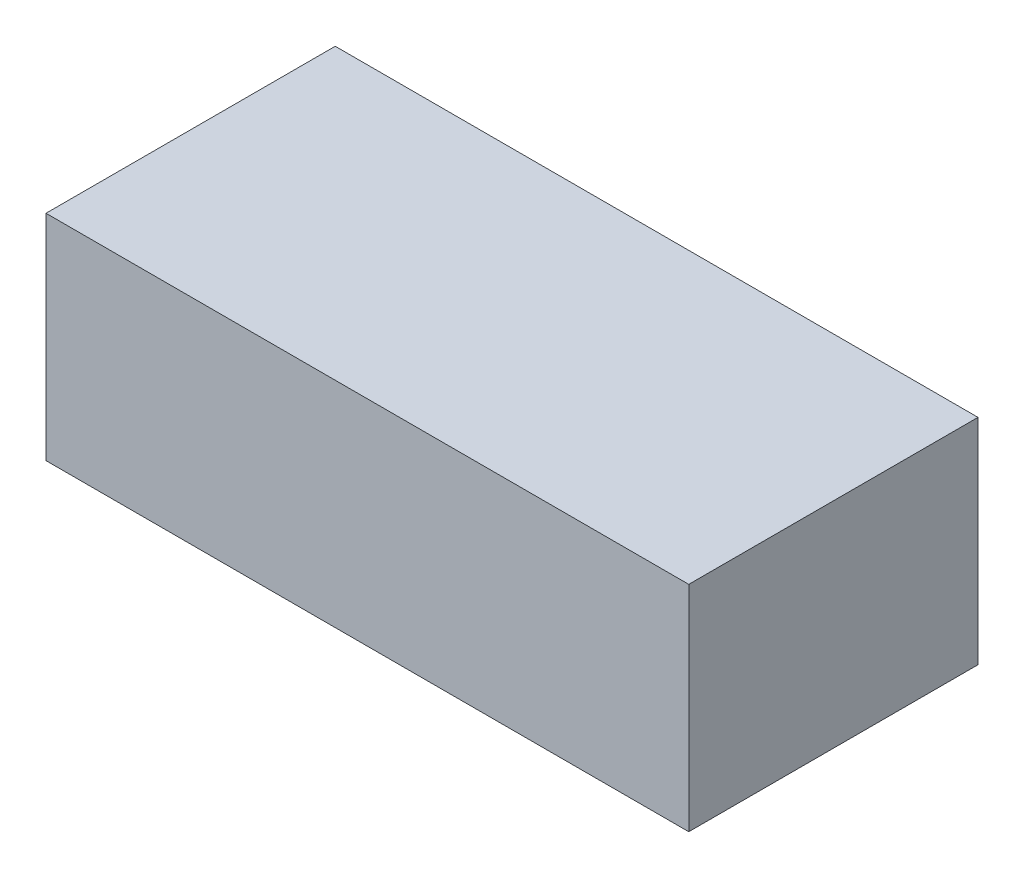
ISO-10303-21;
HEADER;
FILE_DESCRIPTION(('STEP AP214'),'2;1');
FILE_NAME('part.step','',(''),(''),'','','');
FILE_SCHEMA(('AUTOMOTIVE_DESIGN { 1 0 10303 214 1 1 1 1 }'));
ENDSEC;
DATA;
#1=APPLICATION_CONTEXT('core data for automotive mechanical design processes');
#2=APPLICATION_PROTOCOL_DEFINITION('international standard','automotive_design',2000,#1);
#3=PRODUCT_CONTEXT('',#1,'mechanical');
#4=PRODUCT('Part','Part','',(#3));
#5=PRODUCT_RELATED_PRODUCT_CATEGORY('part','',(#4));
#6=PRODUCT_DEFINITION_FORMATION('','',#4);
#7=PRODUCT_DEFINITION_CONTEXT('part definition',#1,'design');
#8=PRODUCT_DEFINITION('design','',#6,#7);
#9=PRODUCT_DEFINITION_SHAPE('','',#8);
#10=(LENGTH_UNIT() NAMED_UNIT(*) SI_UNIT(.MILLI.,.METRE.));
#11=(NAMED_UNIT(*) PLANE_ANGLE_UNIT() SI_UNIT($,.RADIAN.));
#12=(NAMED_UNIT(*) SI_UNIT($,.STERADIAN.) SOLID_ANGLE_UNIT());
#13=UNCERTAINTY_MEASURE_WITH_UNIT(LENGTH_MEASURE(1.E-05),#10,'distance_accuracy_value','');
#14=(GEOMETRIC_REPRESENTATION_CONTEXT(3) GLOBAL_UNCERTAINTY_ASSIGNED_CONTEXT((#13)) GLOBAL_UNIT_ASSIGNED_CONTEXT((#10,
#11,#12)) REPRESENTATION_CONTEXT('',''));
#15=CARTESIAN_POINT('',(0.,0.,0.));
#16=DIRECTION('',(0.,0.,1.));
#17=DIRECTION('',(1.,0.,0.));
#18=AXIS2_PLACEMENT_3D('',#15,#16,#17);
#19=CARTESIAN_POINT('',(48.75,22.,-58.));
#20=DIRECTION('',(-1.,0.,0.));
#21=DIRECTION('',(0.,0.,1.));
#22=AXIS2_PLACEMENT_3D('',#19,#20,#21);
#23=PLANE('',#22);
#24=DIRECTION('',(0.,0.,-1.));
#25=VECTOR('',#24,1.);
#26=CARTESIAN_POINT('',(48.75,2.,-58.));
#27=LINE('',#26,#25);
#28=CARTESIAN_POINT('',(48.75,2.,-31.));
#29=VERTEX_POINT('',#28);
#30=CARTESIAN_POINT('',(48.75,2.,-58.));
#31=VERTEX_POINT('',#30);
#32=EDGE_CURVE('E101',#29,#31,#27,.T.);
#33=ORIENTED_EDGE('',*,*,#32,.T.);
#34=DIRECTION('',(0.,-1.,0.));
#35=VECTOR('',#34,1.);
#36=CARTESIAN_POINT('',(48.75,22.,-58.));
#37=LINE('',#36,#35);
#38=CARTESIAN_POINT('',(48.75,22.,-58.));
#39=VERTEX_POINT('',#38);
#40=EDGE_CURVE('E11',#39,#31,#37,.T.);
#41=ORIENTED_EDGE('',*,*,#40,.F.);
#42=DIRECTION('',(0.,0.,-1.));
#43=VECTOR('',#42,1.);
#44=CARTESIAN_POINT('',(48.75,22.,-58.));
#45=LINE('',#44,#43);
#46=CARTESIAN_POINT('',(48.75,22.,-31.));
#47=VERTEX_POINT('',#46);
#48=EDGE_CURVE('E89',#47,#39,#45,.T.);
#49=ORIENTED_EDGE('',*,*,#48,.F.);
#50=DIRECTION('',(0.,-1.,0.));
#51=VECTOR('',#50,1.);
#52=CARTESIAN_POINT('',(48.75,22.,-31.));
#53=LINE('',#52,#51);
#54=EDGE_CURVE('E97',#47,#29,#53,.T.);
#55=ORIENTED_EDGE('',*,*,#54,.T.);
#56=EDGE_LOOP('',(#33,#41,#49,#55));
#57=FACE_BOUND('',#56,.T.);
#58=ADVANCED_FACE('F38',(#57),#23,.F.);
#59=CARTESIAN_POINT('',(48.75,22.,-58.));
#60=DIRECTION('',(0.,0.,1.));
#61=DIRECTION('',(1.,0.,0.));
#62=AXIS2_PLACEMENT_3D('',#59,#60,#61);
#63=PLANE('',#62);
#64=DIRECTION('',(-1.,0.,0.));
#65=VECTOR('',#64,1.);
#66=CARTESIAN_POINT('',(48.75,2.,-58.));
#67=LINE('',#66,#65);
#68=CARTESIAN_POINT('',(-11.25,2.,-58.));
#69=VERTEX_POINT('',#68);
#70=EDGE_CURVE('E93',#31,#69,#67,.T.);
#71=ORIENTED_EDGE('',*,*,#70,.T.);
#72=DIRECTION('',(0.,-1.,0.));
#73=VECTOR('',#72,1.);
#74=CARTESIAN_POINT('',(-11.25,22.,-58.));
#75=LINE('',#74,#73);
#76=CARTESIAN_POINT('',(-11.25,22.,-58.));
#77=VERTEX_POINT('',#76);
#78=EDGE_CURVE('E46',#77,#69,#75,.T.);
#79=ORIENTED_EDGE('',*,*,#78,.F.);
#80=DIRECTION('',(-1.,0.,0.));
#81=VECTOR('',#80,1.);
#82=CARTESIAN_POINT('',(48.75,22.,-58.));
#83=LINE('',#82,#81);
#84=EDGE_CURVE('E84',#39,#77,#83,.T.);
#85=ORIENTED_EDGE('',*,*,#84,.F.);
#86=ORIENTED_EDGE('',*,*,#40,.T.);
#87=EDGE_LOOP('',(#71,#79,#85,#86));
#88=FACE_BOUND('',#87,.T.);
#89=ADVANCED_FACE('F92',(#88),#63,.F.);
#90=CARTESIAN_POINT('',(-11.25,22.,-58.));
#91=DIRECTION('',(1.,0.,0.));
#92=DIRECTION('',(0.,0.,-1.));
#93=AXIS2_PLACEMENT_3D('',#90,#91,#92);
#94=PLANE('',#93);
#95=DIRECTION('',(0.,0.,1.));
#96=VECTOR('',#95,1.);
#97=CARTESIAN_POINT('',(-11.25,2.,-58.));
#98=LINE('',#97,#96);
#99=CARTESIAN_POINT('',(-11.25,2.,-31.));
#100=VERTEX_POINT('',#99);
#101=EDGE_CURVE('E71',#69,#100,#98,.T.);
#102=ORIENTED_EDGE('',*,*,#101,.T.);
#103=DIRECTION('',(0.,-1.,0.));
#104=VECTOR('',#103,1.);
#105=CARTESIAN_POINT('',(-11.25,22.,-31.));
#106=LINE('',#105,#104);
#107=CARTESIAN_POINT('',(-11.25,22.,-31.));
#108=VERTEX_POINT('',#107);
#109=EDGE_CURVE('E94',#108,#100,#106,.T.);
#110=ORIENTED_EDGE('',*,*,#109,.F.);
#111=DIRECTION('',(0.,0.,1.));
#112=VECTOR('',#111,1.);
#113=CARTESIAN_POINT('',(-11.25,22.,-58.));
#114=LINE('',#113,#112);
#115=EDGE_CURVE('E87',#77,#108,#114,.T.);
#116=ORIENTED_EDGE('',*,*,#115,.F.);
#117=ORIENTED_EDGE('',*,*,#78,.T.);
#118=EDGE_LOOP('',(#102,#110,#116,#117));
#119=FACE_BOUND('',#118,.T.);
#120=ADVANCED_FACE('F95',(#119),#94,.F.);
#121=CARTESIAN_POINT('',(48.75,22.,-31.));
#122=DIRECTION('',(0.,0.,-1.));
#123=DIRECTION('',(-1.,0.,0.));
#124=AXIS2_PLACEMENT_3D('',#121,#122,#123);
#125=PLANE('',#124);
#126=DIRECTION('',(1.,0.,0.));
#127=VECTOR('',#126,1.);
#128=CARTESIAN_POINT('',(48.75,2.,-31.));
#129=LINE('',#128,#127);
#130=EDGE_CURVE('E77',#100,#29,#129,.T.);
#131=ORIENTED_EDGE('',*,*,#130,.T.);
#132=ORIENTED_EDGE('',*,*,#54,.F.);
#133=DIRECTION('',(1.,0.,0.));
#134=VECTOR('',#133,1.);
#135=CARTESIAN_POINT('',(48.75,22.,-31.));
#136=LINE('',#135,#134);
#137=EDGE_CURVE('E54',#108,#47,#136,.T.);
#138=ORIENTED_EDGE('',*,*,#137,.F.);
#139=ORIENTED_EDGE('',*,*,#109,.T.);
#140=EDGE_LOOP('',(#131,#132,#138,#139));
#141=FACE_BOUND('',#140,.T.);
#142=ADVANCED_FACE('F108',(#141),#125,.F.);
#143=CARTESIAN_POINT('',(0.,22.,0.));
#144=DIRECTION('',(0.,-1.,0.));
#145=DIRECTION('',(0.,0.,-1.));
#146=AXIS2_PLACEMENT_3D('',#143,#144,#145);
#147=PLANE('',#146);
#148=ORIENTED_EDGE('',*,*,#48,.T.);
#149=ORIENTED_EDGE('',*,*,#84,.T.);
#150=ORIENTED_EDGE('',*,*,#115,.T.);
#151=ORIENTED_EDGE('',*,*,#137,.T.);
#152=EDGE_LOOP('',(#148,#149,#150,#151));
#153=FACE_BOUND('',#152,.T.);
#154=ADVANCED_FACE('F85',(#153),#147,.F.);
#155=CARTESIAN_POINT('',(0.,2.,0.));
#156=DIRECTION('',(0.,-1.,0.));
#157=DIRECTION('',(0.,0.,-1.));
#158=AXIS2_PLACEMENT_3D('',#155,#156,#157);
#159=PLANE('',#158);
#160=ORIENTED_EDGE('',*,*,#32,.F.);
#161=ORIENTED_EDGE('',*,*,#130,.F.);
#162=ORIENTED_EDGE('',*,*,#101,.F.);
#163=ORIENTED_EDGE('',*,*,#70,.F.);
#164=EDGE_LOOP('',(#160,#161,#162,#163));
#165=FACE_BOUND('',#164,.T.);
#166=ADVANCED_FACE('F111',(#165),#159,.T.);
#167=CLOSED_SHELL('',(#58,#89,#120,#142,#154,#166));
#168=MANIFOLD_SOLID_BREP('B2',#167);
#169=ADVANCED_BREP_SHAPE_REPRESENTATION('',(#18,#168),#14);
#170=SHAPE_DEFINITION_REPRESENTATION(#9,#169);
ENDSEC;
END-ISO-10303-21;
